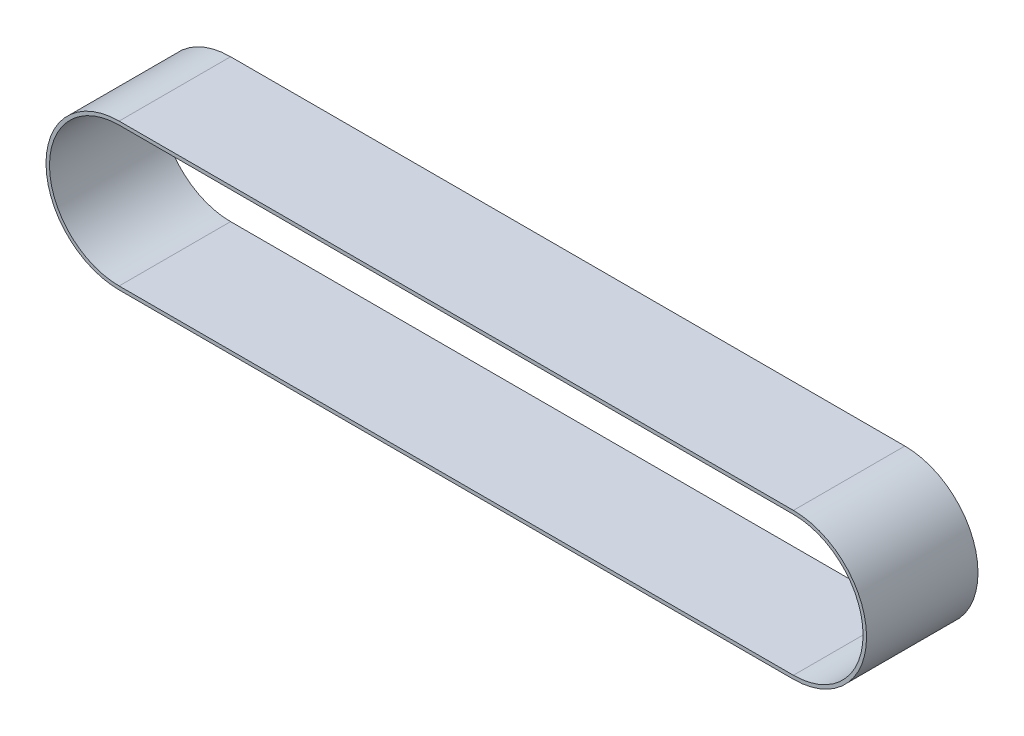
ISO-10303-21;
HEADER;
FILE_DESCRIPTION(('STEP AP214'),'2;1');
FILE_NAME('part.step','',(''),(''),'','','');
FILE_SCHEMA(('AUTOMOTIVE_DESIGN { 1 0 10303 214 1 1 1 1 }'));
ENDSEC;
DATA;
#1=APPLICATION_CONTEXT('core data for automotive mechanical design processes');
#2=APPLICATION_PROTOCOL_DEFINITION('international standard','automotive_design',2000,#1);
#3=PRODUCT_CONTEXT('',#1,'mechanical');
#4=PRODUCT('Part','Part','',(#3));
#5=PRODUCT_RELATED_PRODUCT_CATEGORY('part','',(#4));
#6=PRODUCT_DEFINITION_FORMATION('','',#4);
#7=PRODUCT_DEFINITION_CONTEXT('part definition',#1,'design');
#8=PRODUCT_DEFINITION('design','',#6,#7);
#9=PRODUCT_DEFINITION_SHAPE('','',#8);
#10=(LENGTH_UNIT() NAMED_UNIT(*) SI_UNIT(.MILLI.,.METRE.));
#11=(NAMED_UNIT(*) PLANE_ANGLE_UNIT() SI_UNIT($,.RADIAN.));
#12=(NAMED_UNIT(*) SI_UNIT($,.STERADIAN.) SOLID_ANGLE_UNIT());
#13=UNCERTAINTY_MEASURE_WITH_UNIT(LENGTH_MEASURE(1.E-05),#10,'distance_accuracy_value','');
#14=(GEOMETRIC_REPRESENTATION_CONTEXT(3) GLOBAL_UNCERTAINTY_ASSIGNED_CONTEXT((#13)) GLOBAL_UNIT_ASSIGNED_CONTEXT((#10,
#11,#12)) REPRESENTATION_CONTEXT('',''));
#15=CARTESIAN_POINT('',(0.,0.,0.));
#16=DIRECTION('',(0.,0.,1.));
#17=DIRECTION('',(1.,0.,0.));
#18=AXIS2_PLACEMENT_3D('',#15,#16,#17);
#19=CARTESIAN_POINT('',(0.,0.,50.8));
#20=DIRECTION('',(0.,0.,1.));
#21=DIRECTION('',(1.,0.,0.));
#22=AXIS2_PLACEMENT_3D('',#19,#20,#21);
#23=PLANE('',#22);
#24=CARTESIAN_POINT('',(0.,0.,50.8));
#25=DIRECTION('',(0.,0.,1.));
#26=DIRECTION('',(1.,0.,0.));
#27=AXIS2_PLACEMENT_3D('',#24,#25,#26);
#28=CIRCLE('',#27,33.3375);
#29=CARTESIAN_POINT('',(0.,33.3375,50.8));
#30=VERTEX_POINT('',#29);
#31=CARTESIAN_POINT('',(0.,-33.3375,50.8));
#32=VERTEX_POINT('',#31);
#33=EDGE_CURVE('E134',#30,#32,#28,.T.);
#34=ORIENTED_EDGE('',*,*,#33,.T.);
#35=DIRECTION('',(1.,0.,0.));
#36=VECTOR('',#35,1.);
#37=CARTESIAN_POINT('',(0.,-33.3375,50.8));
#38=LINE('',#37,#36);
#39=CARTESIAN_POINT('',(307.34,-33.3375,50.8));
#40=VERTEX_POINT('',#39);
#41=EDGE_CURVE('E137',#32,#40,#38,.T.);
#42=ORIENTED_EDGE('',*,*,#41,.T.);
#43=CARTESIAN_POINT('',(307.34,0.,50.8));
#44=DIRECTION('',(0.,0.,1.));
#45=DIRECTION('',(1.,0.,0.));
#46=AXIS2_PLACEMENT_3D('',#43,#44,#45);
#47=CIRCLE('',#46,33.3375);
#48=CARTESIAN_POINT('',(307.34,33.3375,50.8));
#49=VERTEX_POINT('',#48);
#50=EDGE_CURVE('E140',#40,#49,#47,.T.);
#51=ORIENTED_EDGE('',*,*,#50,.T.);
#52=DIRECTION('',(-1.,0.,0.));
#53=VECTOR('',#52,1.);
#54=CARTESIAN_POINT('',(0.,33.3375,50.8));
#55=LINE('',#54,#53);
#56=EDGE_CURVE('E142',#49,#30,#55,.T.);
#57=ORIENTED_EDGE('',*,*,#56,.T.);
#58=EDGE_LOOP('',(#34,#42,#51,#57));
#59=FACE_BOUND('',#58,.T.);
#60=DIRECTION('',(1.,0.,0.));
#61=VECTOR('',#60,1.);
#62=CARTESIAN_POINT('',(0.,-31.75,50.8));
#63=LINE('',#62,#61);
#64=CARTESIAN_POINT('',(0.,-31.75,50.8));
#65=VERTEX_POINT('',#64);
#66=CARTESIAN_POINT('',(307.34,-31.75,50.8));
#67=VERTEX_POINT('',#66);
#68=EDGE_CURVE('E106',#65,#67,#63,.T.);
#69=ORIENTED_EDGE('',*,*,#68,.F.);
#70=CARTESIAN_POINT('',(0.,0.,50.8));
#71=DIRECTION('',(0.,0.,1.));
#72=DIRECTION('',(1.,0.,0.));
#73=AXIS2_PLACEMENT_3D('',#70,#71,#72);
#74=CIRCLE('',#73,31.75);
#75=CARTESIAN_POINT('',(0.,31.75,50.8));
#76=VERTEX_POINT('',#75);
#77=EDGE_CURVE('E98',#76,#65,#74,.T.);
#78=ORIENTED_EDGE('',*,*,#77,.F.);
#79=DIRECTION('',(-1.,0.,0.));
#80=VECTOR('',#79,1.);
#81=CARTESIAN_POINT('',(0.,31.75,50.8));
#82=LINE('',#81,#80);
#83=CARTESIAN_POINT('',(307.34,31.75,50.8));
#84=VERTEX_POINT('',#83);
#85=EDGE_CURVE('E120',#84,#76,#82,.T.);
#86=ORIENTED_EDGE('',*,*,#85,.F.);
#87=CARTESIAN_POINT('',(307.34,0.,50.8));
#88=DIRECTION('',(0.,0.,1.));
#89=DIRECTION('',(1.,0.,0.));
#90=AXIS2_PLACEMENT_3D('',#87,#88,#89);
#91=CIRCLE('',#90,31.75);
#92=EDGE_CURVE('E118',#67,#84,#91,.T.);
#93=ORIENTED_EDGE('',*,*,#92,.F.);
#94=EDGE_LOOP('',(#69,#78,#86,#93));
#95=FACE_BOUND('',#94,.T.);
#96=ADVANCED_FACE('F33',(#59,#95),#23,.T.);
#97=CARTESIAN_POINT('',(0.,0.,0.));
#98=DIRECTION('',(0.,0.,1.));
#99=DIRECTION('',(1.,0.,0.));
#100=AXIS2_PLACEMENT_3D('',#97,#98,#99);
#101=PLANE('',#100);
#102=CARTESIAN_POINT('',(0.,0.,0.));
#103=DIRECTION('',(0.,0.,1.));
#104=DIRECTION('',(1.,0.,0.));
#105=AXIS2_PLACEMENT_3D('',#102,#103,#104);
#106=CIRCLE('',#105,33.3375);
#107=CARTESIAN_POINT('',(0.,33.3375,0.));
#108=VERTEX_POINT('',#107);
#109=CARTESIAN_POINT('',(0.,-33.3375,0.));
#110=VERTEX_POINT('',#109);
#111=EDGE_CURVE('E114',#108,#110,#106,.T.);
#112=ORIENTED_EDGE('',*,*,#111,.F.);
#113=DIRECTION('',(-1.,0.,0.));
#114=VECTOR('',#113,1.);
#115=CARTESIAN_POINT('',(0.,33.3375,0.));
#116=LINE('',#115,#114);
#117=CARTESIAN_POINT('',(307.34,33.3375,0.));
#118=VERTEX_POINT('',#117);
#119=EDGE_CURVE('E138',#118,#108,#116,.T.);
#120=ORIENTED_EDGE('',*,*,#119,.F.);
#121=CARTESIAN_POINT('',(307.34,0.,0.));
#122=DIRECTION('',(0.,0.,1.));
#123=DIRECTION('',(1.,0.,0.));
#124=AXIS2_PLACEMENT_3D('',#121,#122,#123);
#125=CIRCLE('',#124,33.3375);
#126=CARTESIAN_POINT('',(307.34,-33.3375,0.));
#127=VERTEX_POINT('',#126);
#128=EDGE_CURVE('E149',#127,#118,#125,.T.);
#129=ORIENTED_EDGE('',*,*,#128,.F.);
#130=DIRECTION('',(1.,0.,0.));
#131=VECTOR('',#130,1.);
#132=CARTESIAN_POINT('',(0.,-33.3375,0.));
#133=LINE('',#132,#131);
#134=EDGE_CURVE('E147',#110,#127,#133,.T.);
#135=ORIENTED_EDGE('',*,*,#134,.F.);
#136=EDGE_LOOP('',(#112,#120,#129,#135));
#137=FACE_BOUND('',#136,.T.);
#138=CARTESIAN_POINT('',(0.,0.,0.));
#139=DIRECTION('',(0.,0.,1.));
#140=DIRECTION('',(1.,0.,0.));
#141=AXIS2_PLACEMENT_3D('',#138,#139,#140);
#142=CIRCLE('',#141,31.75);
#143=CARTESIAN_POINT('',(0.,31.75,0.));
#144=VERTEX_POINT('',#143);
#145=CARTESIAN_POINT('',(0.,-31.75,0.));
#146=VERTEX_POINT('',#145);
#147=EDGE_CURVE('E56',#144,#146,#142,.T.);
#148=ORIENTED_EDGE('',*,*,#147,.T.);
#149=DIRECTION('',(1.,0.,0.));
#150=VECTOR('',#149,1.);
#151=CARTESIAN_POINT('',(0.,-31.75,0.));
#152=LINE('',#151,#150);
#153=CARTESIAN_POINT('',(307.34,-31.75,0.));
#154=VERTEX_POINT('',#153);
#155=EDGE_CURVE('E113',#146,#154,#152,.T.);
#156=ORIENTED_EDGE('',*,*,#155,.T.);
#157=CARTESIAN_POINT('',(307.34,0.,0.));
#158=DIRECTION('',(0.,0.,1.));
#159=DIRECTION('',(1.,0.,0.));
#160=AXIS2_PLACEMENT_3D('',#157,#158,#159);
#161=CIRCLE('',#160,31.75);
#162=CARTESIAN_POINT('',(307.34,31.75,0.));
#163=VERTEX_POINT('',#162);
#164=EDGE_CURVE('E126',#154,#163,#161,.T.);
#165=ORIENTED_EDGE('',*,*,#164,.T.);
#166=DIRECTION('',(-1.,0.,0.));
#167=VECTOR('',#166,1.);
#168=CARTESIAN_POINT('',(0.,31.75,0.));
#169=LINE('',#168,#167);
#170=EDGE_CURVE('E107',#163,#144,#169,.T.);
#171=ORIENTED_EDGE('',*,*,#170,.T.);
#172=EDGE_LOOP('',(#148,#156,#165,#171));
#173=FACE_BOUND('',#172,.T.);
#174=ADVANCED_FACE('F167',(#137,#173),#101,.F.);
#175=CARTESIAN_POINT('',(0.,0.,50.8));
#176=DIRECTION('',(0.,0.,-1.));
#177=DIRECTION('',(-1.,0.,0.));
#178=AXIS2_PLACEMENT_3D('',#175,#176,#177);
#179=CYLINDRICAL_SURFACE('',#178,33.3375);
#180=ORIENTED_EDGE('',*,*,#111,.T.);
#181=DIRECTION('',(0.,0.,-1.));
#182=VECTOR('',#181,1.);
#183=CARTESIAN_POINT('',(0.,-33.3375,50.8));
#184=LINE('',#183,#182);
#185=EDGE_CURVE('E11',#32,#110,#184,.T.);
#186=ORIENTED_EDGE('',*,*,#185,.F.);
#187=ORIENTED_EDGE('',*,*,#33,.F.);
#188=DIRECTION('',(0.,0.,-1.));
#189=VECTOR('',#188,1.);
#190=CARTESIAN_POINT('',(0.,33.3375,50.8));
#191=LINE('',#190,#189);
#192=EDGE_CURVE('E144',#30,#108,#191,.T.);
#193=ORIENTED_EDGE('',*,*,#192,.T.);
#194=EDGE_LOOP('',(#180,#186,#187,#193));
#195=FACE_BOUND('',#194,.T.);
#196=ADVANCED_FACE('F35',(#195),#179,.T.);
#197=CARTESIAN_POINT('',(0.,-33.3375,50.8));
#198=DIRECTION('',(0.,1.,0.));
#199=DIRECTION('',(0.,0.,1.));
#200=AXIS2_PLACEMENT_3D('',#197,#198,#199);
#201=PLANE('',#200);
#202=ORIENTED_EDGE('',*,*,#134,.T.);
#203=DIRECTION('',(0.,0.,-1.));
#204=VECTOR('',#203,1.);
#205=CARTESIAN_POINT('',(307.34,-33.3375,50.8));
#206=LINE('',#205,#204);
#207=EDGE_CURVE('E41',#40,#127,#206,.T.);
#208=ORIENTED_EDGE('',*,*,#207,.F.);
#209=ORIENTED_EDGE('',*,*,#41,.F.);
#210=ORIENTED_EDGE('',*,*,#185,.T.);
#211=EDGE_LOOP('',(#202,#208,#209,#210));
#212=FACE_BOUND('',#211,.T.);
#213=ADVANCED_FACE('F177',(#212),#201,.F.);
#214=CARTESIAN_POINT('',(307.34,0.,50.8));
#215=DIRECTION('',(0.,0.,-1.));
#216=DIRECTION('',(-1.,0.,0.));
#217=AXIS2_PLACEMENT_3D('',#214,#215,#216);
#218=CYLINDRICAL_SURFACE('',#217,33.3375);
#219=ORIENTED_EDGE('',*,*,#128,.T.);
#220=DIRECTION('',(0.,0.,-1.));
#221=VECTOR('',#220,1.);
#222=CARTESIAN_POINT('',(307.34,33.3375,50.8));
#223=LINE('',#222,#221);
#224=EDGE_CURVE('E154',#49,#118,#223,.T.);
#225=ORIENTED_EDGE('',*,*,#224,.F.);
#226=ORIENTED_EDGE('',*,*,#50,.F.);
#227=ORIENTED_EDGE('',*,*,#207,.T.);
#228=EDGE_LOOP('',(#219,#225,#226,#227));
#229=FACE_BOUND('',#228,.T.);
#230=ADVANCED_FACE('F161',(#229),#218,.T.);
#231=CARTESIAN_POINT('',(0.,33.3375,50.8));
#232=DIRECTION('',(0.,-1.,0.));
#233=DIRECTION('',(0.,0.,-1.));
#234=AXIS2_PLACEMENT_3D('',#231,#232,#233);
#235=PLANE('',#234);
#236=ORIENTED_EDGE('',*,*,#119,.T.);
#237=ORIENTED_EDGE('',*,*,#192,.F.);
#238=ORIENTED_EDGE('',*,*,#56,.F.);
#239=ORIENTED_EDGE('',*,*,#224,.T.);
#240=EDGE_LOOP('',(#236,#237,#238,#239));
#241=FACE_BOUND('',#240,.T.);
#242=ADVANCED_FACE('F171',(#241),#235,.F.);
#243=CARTESIAN_POINT('',(0.,0.,50.8));
#244=DIRECTION('',(0.,0.,-1.));
#245=DIRECTION('',(-1.,0.,0.));
#246=AXIS2_PLACEMENT_3D('',#243,#244,#245);
#247=CYLINDRICAL_SURFACE('',#246,31.75);
#248=ORIENTED_EDGE('',*,*,#147,.F.);
#249=DIRECTION('',(0.,0.,-1.));
#250=VECTOR('',#249,1.);
#251=CARTESIAN_POINT('',(0.,31.75,50.8));
#252=LINE('',#251,#250);
#253=EDGE_CURVE('E102',#76,#144,#252,.T.);
#254=ORIENTED_EDGE('',*,*,#253,.F.);
#255=ORIENTED_EDGE('',*,*,#77,.T.);
#256=DIRECTION('',(0.,0.,-1.));
#257=VECTOR('',#256,1.);
#258=CARTESIAN_POINT('',(0.,-31.75,50.8));
#259=LINE('',#258,#257);
#260=EDGE_CURVE('E101',#65,#146,#259,.T.);
#261=ORIENTED_EDGE('',*,*,#260,.T.);
#262=EDGE_LOOP('',(#248,#254,#255,#261));
#263=FACE_BOUND('',#262,.T.);
#264=ADVANCED_FACE('F100',(#263),#247,.F.);
#265=CARTESIAN_POINT('',(0.,-31.75,50.8));
#266=DIRECTION('',(0.,1.,0.));
#267=DIRECTION('',(0.,0.,1.));
#268=AXIS2_PLACEMENT_3D('',#265,#266,#267);
#269=PLANE('',#268);
#270=ORIENTED_EDGE('',*,*,#155,.F.);
#271=ORIENTED_EDGE('',*,*,#260,.F.);
#272=ORIENTED_EDGE('',*,*,#68,.T.);
#273=DIRECTION('',(0.,0.,-1.));
#274=VECTOR('',#273,1.);
#275=CARTESIAN_POINT('',(307.34,-31.75,50.8));
#276=LINE('',#275,#274);
#277=EDGE_CURVE('E115',#67,#154,#276,.T.);
#278=ORIENTED_EDGE('',*,*,#277,.T.);
#279=EDGE_LOOP('',(#270,#271,#272,#278));
#280=FACE_BOUND('',#279,.T.);
#281=ADVANCED_FACE('F110',(#280),#269,.T.);
#282=CARTESIAN_POINT('',(307.34,0.,50.8));
#283=DIRECTION('',(0.,0.,-1.));
#284=DIRECTION('',(-1.,0.,0.));
#285=AXIS2_PLACEMENT_3D('',#282,#283,#284);
#286=CYLINDRICAL_SURFACE('',#285,31.75);
#287=ORIENTED_EDGE('',*,*,#164,.F.);
#288=ORIENTED_EDGE('',*,*,#277,.F.);
#289=ORIENTED_EDGE('',*,*,#92,.T.);
#290=DIRECTION('',(0.,0.,-1.));
#291=VECTOR('',#290,1.);
#292=CARTESIAN_POINT('',(307.34,31.75,50.8));
#293=LINE('',#292,#291);
#294=EDGE_CURVE('E48',#84,#163,#293,.T.);
#295=ORIENTED_EDGE('',*,*,#294,.T.);
#296=EDGE_LOOP('',(#287,#288,#289,#295));
#297=FACE_BOUND('',#296,.T.);
#298=ADVANCED_FACE('F200',(#297),#286,.F.);
#299=CARTESIAN_POINT('',(0.,31.75,50.8));
#300=DIRECTION('',(0.,-1.,0.));
#301=DIRECTION('',(0.,0.,-1.));
#302=AXIS2_PLACEMENT_3D('',#299,#300,#301);
#303=PLANE('',#302);
#304=ORIENTED_EDGE('',*,*,#170,.F.);
#305=ORIENTED_EDGE('',*,*,#294,.F.);
#306=ORIENTED_EDGE('',*,*,#85,.T.);
#307=ORIENTED_EDGE('',*,*,#253,.T.);
#308=EDGE_LOOP('',(#304,#305,#306,#307));
#309=FACE_BOUND('',#308,.T.);
#310=ADVANCED_FACE('F204',(#309),#303,.T.);
#311=CLOSED_SHELL('',(#96,#174,#196,#213,#230,#242,#264,#281,#298,#310));
#312=MANIFOLD_SOLID_BREP('B2',#311);
#313=ADVANCED_BREP_SHAPE_REPRESENTATION('',(#18,#312),#14);
#314=SHAPE_DEFINITION_REPRESENTATION(#9,#313);
ENDSEC;
END-ISO-10303-21;
